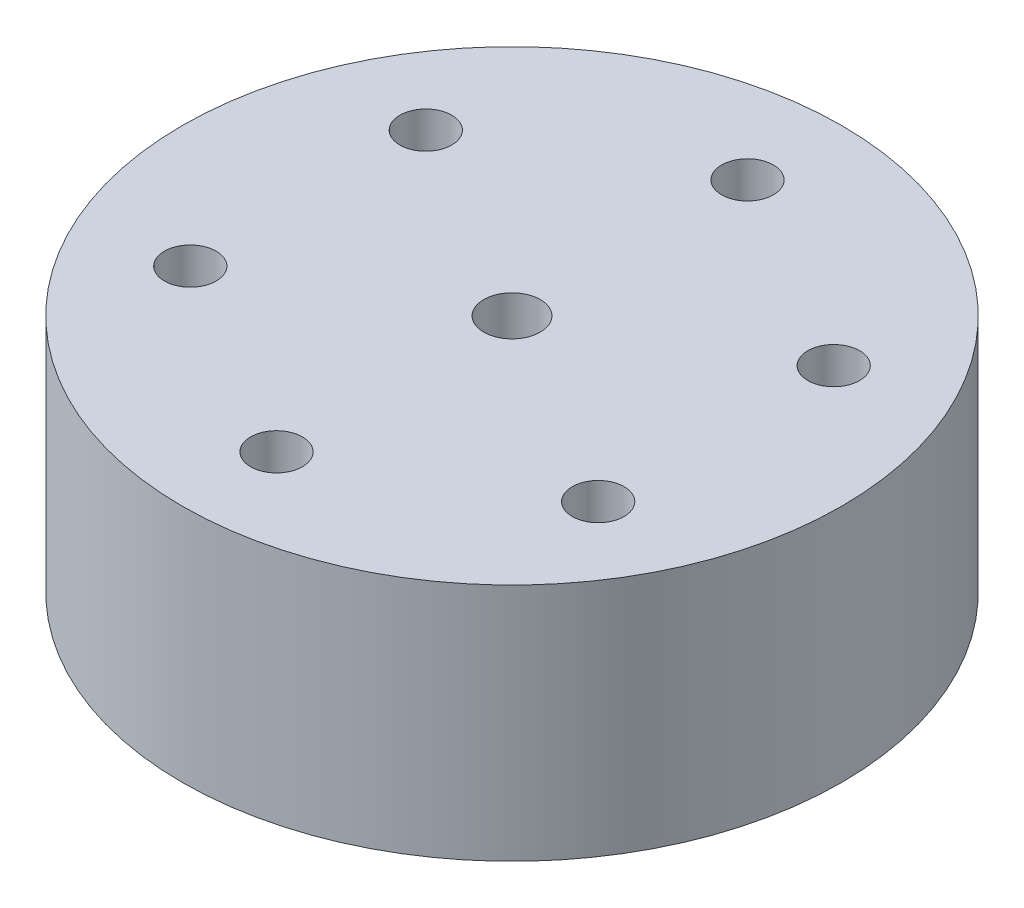
ISO-10303-21;
HEADER;
FILE_DESCRIPTION(('STEP AP214'),'2;1');
FILE_NAME('part.step','',(''),(''),'','','');
FILE_SCHEMA(('AUTOMOTIVE_DESIGN { 1 0 10303 214 1 1 1 1 }'));
ENDSEC;
DATA;
#1=APPLICATION_CONTEXT('core data for automotive mechanical design processes');
#2=APPLICATION_PROTOCOL_DEFINITION('international standard','automotive_design',2000,#1);
#3=PRODUCT_CONTEXT('',#1,'mechanical');
#4=PRODUCT('Part','Part','',(#3));
#5=PRODUCT_RELATED_PRODUCT_CATEGORY('part','',(#4));
#6=PRODUCT_DEFINITION_FORMATION('','',#4);
#7=PRODUCT_DEFINITION_CONTEXT('part definition',#1,'design');
#8=PRODUCT_DEFINITION('design','',#6,#7);
#9=PRODUCT_DEFINITION_SHAPE('','',#8);
#10=(LENGTH_UNIT() NAMED_UNIT(*) SI_UNIT(.MILLI.,.METRE.));
#11=(NAMED_UNIT(*) PLANE_ANGLE_UNIT() SI_UNIT($,.RADIAN.));
#12=(NAMED_UNIT(*) SI_UNIT($,.STERADIAN.) SOLID_ANGLE_UNIT());
#13=UNCERTAINTY_MEASURE_WITH_UNIT(LENGTH_MEASURE(1.E-05),#10,'distance_accuracy_value','');
#14=(GEOMETRIC_REPRESENTATION_CONTEXT(3) GLOBAL_UNCERTAINTY_ASSIGNED_CONTEXT((#13)) GLOBAL_UNIT_ASSIGNED_CONTEXT((#10,
#11,#12)) REPRESENTATION_CONTEXT('',''));
#15=CARTESIAN_POINT('',(0.,0.,0.));
#16=DIRECTION('',(0.,0.,1.));
#17=DIRECTION('',(1.,0.,0.));
#18=AXIS2_PLACEMENT_3D('',#15,#16,#17);
#19=CARTESIAN_POINT('',(0.,25.4,0.));
#20=DIRECTION('',(0.,-1.,0.));
#21=DIRECTION('',(0.,0.,-1.));
#22=AXIS2_PLACEMENT_3D('',#19,#20,#21);
#23=CYLINDRICAL_SURFACE('',#22,35.);
#24=CARTESIAN_POINT('',(0.,25.4,0.));
#25=DIRECTION('',(0.,1.,0.));
#26=DIRECTION('',(0.,0.,1.));
#27=AXIS2_PLACEMENT_3D('',#24,#25,#26);
#28=CIRCLE('',#27,35.);
#29=CARTESIAN_POINT('',(0.,25.4,35.));
#30=VERTEX_POINT('',#29);
#31=EDGE_CURVE('E10',#30,#30,#28,.T.);
#32=ORIENTED_EDGE('',*,*,#31,.F.);
#33=EDGE_LOOP('',(#32));
#34=FACE_BOUND('',#33,.T.);
#35=CARTESIAN_POINT('',(0.,0.,0.));
#36=DIRECTION('',(0.,1.,0.));
#37=DIRECTION('',(0.,0.,1.));
#38=AXIS2_PLACEMENT_3D('',#35,#36,#37);
#39=CIRCLE('',#38,35.);
#40=CARTESIAN_POINT('',(0.,0.,35.));
#41=VERTEX_POINT('',#40);
#42=EDGE_CURVE('E40',#41,#41,#39,.T.);
#43=ORIENTED_EDGE('',*,*,#42,.T.);
#44=EDGE_LOOP('',(#43));
#45=FACE_BOUND('',#44,.T.);
#46=ADVANCED_FACE('F37',(#34,#45),#23,.T.);
#47=CARTESIAN_POINT('',(0.,25.4,0.));
#48=DIRECTION('',(0.,1.,0.));
#49=DIRECTION('',(0.,0.,1.));
#50=AXIS2_PLACEMENT_3D('',#47,#48,#49);
#51=PLANE('',#50);
#52=CARTESIAN_POINT('',(0.,25.4,-25.));
#53=DIRECTION('',(0.,1.,0.));
#54=DIRECTION('',(0.,0.,1.));
#55=AXIS2_PLACEMENT_3D('',#52,#53,#54);
#56=CIRCLE('',#55,2.75);
#57=CARTESIAN_POINT('',(0.,25.4,-22.25));
#58=VERTEX_POINT('',#57);
#59=EDGE_CURVE('E80',#58,#58,#56,.T.);
#60=ORIENTED_EDGE('',*,*,#59,.F.);
#61=EDGE_LOOP('',(#60));
#62=FACE_BOUND('',#61,.T.);
#63=CARTESIAN_POINT('',(-21.6506350946112,25.4,-12.4999999999995));
#64=DIRECTION('',(0.,1.,0.));
#65=DIRECTION('',(0.,0.,1.));
#66=AXIS2_PLACEMENT_3D('',#63,#64,#65);
#67=CIRCLE('',#66,2.75);
#68=CARTESIAN_POINT('',(-21.6506350946112,25.4,-9.74999999999953));
#69=VERTEX_POINT('',#68);
#70=EDGE_CURVE('E59',#69,#69,#67,.T.);
#71=ORIENTED_EDGE('',*,*,#70,.F.);
#72=EDGE_LOOP('',(#71));
#73=FACE_BOUND('',#72,.T.);
#74=CARTESIAN_POINT('',(-21.650635094611,25.4,12.5));
#75=DIRECTION('',(0.,1.,0.));
#76=DIRECTION('',(0.,0.,1.));
#77=AXIS2_PLACEMENT_3D('',#74,#75,#76);
#78=CIRCLE('',#77,2.75);
#79=CARTESIAN_POINT('',(-21.650635094611,25.4,15.25));
#80=VERTEX_POINT('',#79);
#81=EDGE_CURVE('E58',#80,#80,#78,.T.);
#82=ORIENTED_EDGE('',*,*,#81,.F.);
#83=EDGE_LOOP('',(#82));
#84=FACE_BOUND('',#83,.T.);
#85=CARTESIAN_POINT('',(0.,25.4,25.));
#86=DIRECTION('',(0.,1.,0.));
#87=DIRECTION('',(0.,0.,1.));
#88=AXIS2_PLACEMENT_3D('',#85,#86,#87);
#89=CIRCLE('',#88,2.75);
#90=CARTESIAN_POINT('',(0.,25.4,27.75));
#91=VERTEX_POINT('',#90);
#92=EDGE_CURVE('E65',#91,#91,#89,.T.);
#93=ORIENTED_EDGE('',*,*,#92,.F.);
#94=EDGE_LOOP('',(#93));
#95=FACE_BOUND('',#94,.T.);
#96=CARTESIAN_POINT('',(21.650635094611,25.4,12.5));
#97=DIRECTION('',(0.,1.,0.));
#98=DIRECTION('',(0.,0.,1.));
#99=AXIS2_PLACEMENT_3D('',#96,#97,#98);
#100=CIRCLE('',#99,2.75);
#101=CARTESIAN_POINT('',(21.650635094611,25.4,15.25));
#102=VERTEX_POINT('',#101);
#103=EDGE_CURVE('E71',#102,#102,#100,.T.);
#104=ORIENTED_EDGE('',*,*,#103,.F.);
#105=EDGE_LOOP('',(#104));
#106=FACE_BOUND('',#105,.T.);
#107=CARTESIAN_POINT('',(21.6506350946115,25.4,-12.5));
#108=DIRECTION('',(0.,1.,0.));
#109=DIRECTION('',(0.,0.,1.));
#110=AXIS2_PLACEMENT_3D('',#107,#108,#109);
#111=CIRCLE('',#110,2.75);
#112=CARTESIAN_POINT('',(21.6506350946115,25.4,-9.75000000000001));
#113=VERTEX_POINT('',#112);
#114=EDGE_CURVE('E77',#113,#113,#111,.T.);
#115=ORIENTED_EDGE('',*,*,#114,.F.);
#116=EDGE_LOOP('',(#115));
#117=FACE_BOUND('',#116,.T.);
#118=CARTESIAN_POINT('',(0.,25.4,0.));
#119=DIRECTION('',(0.,1.,0.));
#120=DIRECTION('',(0.,0.,1.));
#121=AXIS2_PLACEMENT_3D('',#118,#119,#120);
#122=CIRCLE('',#121,3.);
#123=CARTESIAN_POINT('',(0.,25.4,3.));
#124=VERTEX_POINT('',#123);
#125=EDGE_CURVE('E49',#124,#124,#122,.T.);
#126=ORIENTED_EDGE('',*,*,#125,.F.);
#127=EDGE_LOOP('',(#126));
#128=FACE_BOUND('',#127,.T.);
#129=ORIENTED_EDGE('',*,*,#31,.T.);
#130=EDGE_LOOP('',(#129));
#131=FACE_BOUND('',#130,.T.);
#132=ADVANCED_FACE('F101',(#62,#73,#84,#95,#106,#117,#128,#131),#51,.T.);
#133=CARTESIAN_POINT('',(0.,0.,0.));
#134=DIRECTION('',(0.,1.,0.));
#135=DIRECTION('',(0.,0.,1.));
#136=AXIS2_PLACEMENT_3D('',#133,#134,#135);
#137=PLANE('',#136);
#138=CARTESIAN_POINT('',(0.,0.,-25.));
#139=DIRECTION('',(0.,1.,0.));
#140=DIRECTION('',(0.,0.,1.));
#141=AXIS2_PLACEMENT_3D('',#138,#139,#140);
#142=CIRCLE('',#141,2.75);
#143=CARTESIAN_POINT('',(0.,0.,-22.25));
#144=VERTEX_POINT('',#143);
#145=EDGE_CURVE('E52',#144,#144,#142,.T.);
#146=ORIENTED_EDGE('',*,*,#145,.T.);
#147=EDGE_LOOP('',(#146));
#148=FACE_BOUND('',#147,.T.);
#149=CARTESIAN_POINT('',(-21.6506350946112,0.,-12.4999999999995));
#150=DIRECTION('',(0.,1.,0.));
#151=DIRECTION('',(0.,0.,1.));
#152=AXIS2_PLACEMENT_3D('',#149,#150,#151);
#153=CIRCLE('',#152,2.75);
#154=CARTESIAN_POINT('',(-21.6506350946112,0.,-9.74999999999953));
#155=VERTEX_POINT('',#154);
#156=EDGE_CURVE('E81',#155,#155,#153,.T.);
#157=ORIENTED_EDGE('',*,*,#156,.T.);
#158=EDGE_LOOP('',(#157));
#159=FACE_BOUND('',#158,.T.);
#160=CARTESIAN_POINT('',(-21.650635094611,0.,12.5));
#161=DIRECTION('',(0.,1.,0.));
#162=DIRECTION('',(0.,0.,1.));
#163=AXIS2_PLACEMENT_3D('',#160,#161,#162);
#164=CIRCLE('',#163,2.75);
#165=CARTESIAN_POINT('',(-21.650635094611,0.,15.25));
#166=VERTEX_POINT('',#165);
#167=EDGE_CURVE('E55',#166,#166,#164,.T.);
#168=ORIENTED_EDGE('',*,*,#167,.T.);
#169=EDGE_LOOP('',(#168));
#170=FACE_BOUND('',#169,.T.);
#171=CARTESIAN_POINT('',(0.,0.,25.));
#172=DIRECTION('',(0.,1.,0.));
#173=DIRECTION('',(0.,0.,1.));
#174=AXIS2_PLACEMENT_3D('',#171,#172,#173);
#175=CIRCLE('',#174,2.75);
#176=CARTESIAN_POINT('',(0.,0.,27.75));
#177=VERTEX_POINT('',#176);
#178=EDGE_CURVE('E62',#177,#177,#175,.T.);
#179=ORIENTED_EDGE('',*,*,#178,.T.);
#180=EDGE_LOOP('',(#179));
#181=FACE_BOUND('',#180,.T.);
#182=CARTESIAN_POINT('',(21.650635094611,0.,12.5));
#183=DIRECTION('',(0.,1.,0.));
#184=DIRECTION('',(0.,0.,1.));
#185=AXIS2_PLACEMENT_3D('',#182,#183,#184);
#186=CIRCLE('',#185,2.75);
#187=CARTESIAN_POINT('',(21.650635094611,0.,15.25));
#188=VERTEX_POINT('',#187);
#189=EDGE_CURVE('E68',#188,#188,#186,.T.);
#190=ORIENTED_EDGE('',*,*,#189,.T.);
#191=EDGE_LOOP('',(#190));
#192=FACE_BOUND('',#191,.T.);
#193=CARTESIAN_POINT('',(21.6506350946115,0.,-12.5));
#194=DIRECTION('',(0.,1.,0.));
#195=DIRECTION('',(0.,0.,1.));
#196=AXIS2_PLACEMENT_3D('',#193,#194,#195);
#197=CIRCLE('',#196,2.75);
#198=CARTESIAN_POINT('',(21.6506350946115,0.,-9.75000000000001));
#199=VERTEX_POINT('',#198);
#200=EDGE_CURVE('E74',#199,#199,#197,.T.);
#201=ORIENTED_EDGE('',*,*,#200,.T.);
#202=EDGE_LOOP('',(#201));
#203=FACE_BOUND('',#202,.T.);
#204=CARTESIAN_POINT('',(0.,0.,0.));
#205=DIRECTION('',(0.,1.,0.));
#206=DIRECTION('',(0.,0.,1.));
#207=AXIS2_PLACEMENT_3D('',#204,#205,#206);
#208=CIRCLE('',#207,3.);
#209=CARTESIAN_POINT('',(0.,0.,3.));
#210=VERTEX_POINT('',#209);
#211=EDGE_CURVE('E47',#210,#210,#208,.T.);
#212=ORIENTED_EDGE('',*,*,#211,.T.);
#213=EDGE_LOOP('',(#212));
#214=FACE_BOUND('',#213,.T.);
#215=ORIENTED_EDGE('',*,*,#42,.F.);
#216=EDGE_LOOP('',(#215));
#217=FACE_BOUND('',#216,.T.);
#218=ADVANCED_FACE('F91',(#148,#159,#170,#181,#192,#203,#214,#217),#137,.F.);
#219=CARTESIAN_POINT('',(0.,0.,0.));
#220=DIRECTION('',(0.,1.,0.));
#221=DIRECTION('',(0.,0.,1.));
#222=AXIS2_PLACEMENT_3D('',#219,#220,#221);
#223=CYLINDRICAL_SURFACE('',#222,3.);
#224=ORIENTED_EDGE('',*,*,#125,.T.);
#225=EDGE_LOOP('',(#224));
#226=FACE_BOUND('',#225,.T.);
#227=ORIENTED_EDGE('',*,*,#211,.F.);
#228=EDGE_LOOP('',(#227));
#229=FACE_BOUND('',#228,.T.);
#230=ADVANCED_FACE('F117',(#226,#229),#223,.F.);
#231=CARTESIAN_POINT('',(21.6506350946115,0.,-12.5));
#232=DIRECTION('',(0.,1.,0.));
#233=DIRECTION('',(0.,0.,1.));
#234=AXIS2_PLACEMENT_3D('',#231,#232,#233);
#235=CYLINDRICAL_SURFACE('',#234,2.75);
#236=ORIENTED_EDGE('',*,*,#200,.F.);
#237=EDGE_LOOP('',(#236));
#238=FACE_BOUND('',#237,.T.);
#239=ORIENTED_EDGE('',*,*,#114,.T.);
#240=EDGE_LOOP('',(#239));
#241=FACE_BOUND('',#240,.T.);
#242=ADVANCED_FACE('F120',(#238,#241),#235,.F.);
#243=CARTESIAN_POINT('',(21.650635094611,0.,12.5));
#244=DIRECTION('',(0.,1.,0.));
#245=DIRECTION('',(0.,0.,1.));
#246=AXIS2_PLACEMENT_3D('',#243,#244,#245);
#247=CYLINDRICAL_SURFACE('',#246,2.75);
#248=ORIENTED_EDGE('',*,*,#189,.F.);
#249=EDGE_LOOP('',(#248));
#250=FACE_BOUND('',#249,.T.);
#251=ORIENTED_EDGE('',*,*,#103,.T.);
#252=EDGE_LOOP('',(#251));
#253=FACE_BOUND('',#252,.T.);
#254=ADVANCED_FACE('F150',(#250,#253),#247,.F.);
#255=CARTESIAN_POINT('',(0.,0.,25.));
#256=DIRECTION('',(0.,1.,0.));
#257=DIRECTION('',(0.,0.,1.));
#258=AXIS2_PLACEMENT_3D('',#255,#256,#257);
#259=CYLINDRICAL_SURFACE('',#258,2.75);
#260=ORIENTED_EDGE('',*,*,#178,.F.);
#261=EDGE_LOOP('',(#260));
#262=FACE_BOUND('',#261,.T.);
#263=ORIENTED_EDGE('',*,*,#92,.T.);
#264=EDGE_LOOP('',(#263));
#265=FACE_BOUND('',#264,.T.);
#266=ADVANCED_FACE('F158',(#262,#265),#259,.F.);
#267=CARTESIAN_POINT('',(-21.650635094611,0.,12.5));
#268=DIRECTION('',(0.,1.,0.));
#269=DIRECTION('',(0.,0.,1.));
#270=AXIS2_PLACEMENT_3D('',#267,#268,#269);
#271=CYLINDRICAL_SURFACE('',#270,2.75);
#272=ORIENTED_EDGE('',*,*,#167,.F.);
#273=EDGE_LOOP('',(#272));
#274=FACE_BOUND('',#273,.T.);
#275=ORIENTED_EDGE('',*,*,#81,.T.);
#276=EDGE_LOOP('',(#275));
#277=FACE_BOUND('',#276,.T.);
#278=ADVANCED_FACE('F166',(#274,#277),#271,.F.);
#279=CARTESIAN_POINT('',(-21.6506350946112,0.,-12.4999999999995));
#280=DIRECTION('',(0.,1.,0.));
#281=DIRECTION('',(0.,0.,1.));
#282=AXIS2_PLACEMENT_3D('',#279,#280,#281);
#283=CYLINDRICAL_SURFACE('',#282,2.75);
#284=ORIENTED_EDGE('',*,*,#156,.F.);
#285=EDGE_LOOP('',(#284));
#286=FACE_BOUND('',#285,.T.);
#287=ORIENTED_EDGE('',*,*,#70,.T.);
#288=EDGE_LOOP('',(#287));
#289=FACE_BOUND('',#288,.T.);
#290=ADVANCED_FACE('F97',(#286,#289),#283,.F.);
#291=CARTESIAN_POINT('',(0.,0.,-25.));
#292=DIRECTION('',(0.,1.,0.));
#293=DIRECTION('',(0.,0.,1.));
#294=AXIS2_PLACEMENT_3D('',#291,#292,#293);
#295=CYLINDRICAL_SURFACE('',#294,2.75);
#296=ORIENTED_EDGE('',*,*,#145,.F.);
#297=EDGE_LOOP('',(#296));
#298=FACE_BOUND('',#297,.T.);
#299=ORIENTED_EDGE('',*,*,#59,.T.);
#300=EDGE_LOOP('',(#299));
#301=FACE_BOUND('',#300,.T.);
#302=ADVANCED_FACE('F94',(#298,#301),#295,.F.);
#303=CLOSED_SHELL('',(#46,#132,#218,#230,#242,#254,#266,#278,#290,#302));
#304=MANIFOLD_SOLID_BREP('B2',#303);
#305=ADVANCED_BREP_SHAPE_REPRESENTATION('',(#18,#304),#14);
#306=SHAPE_DEFINITION_REPRESENTATION(#9,#305);
ENDSEC;
END-ISO-10303-21;
